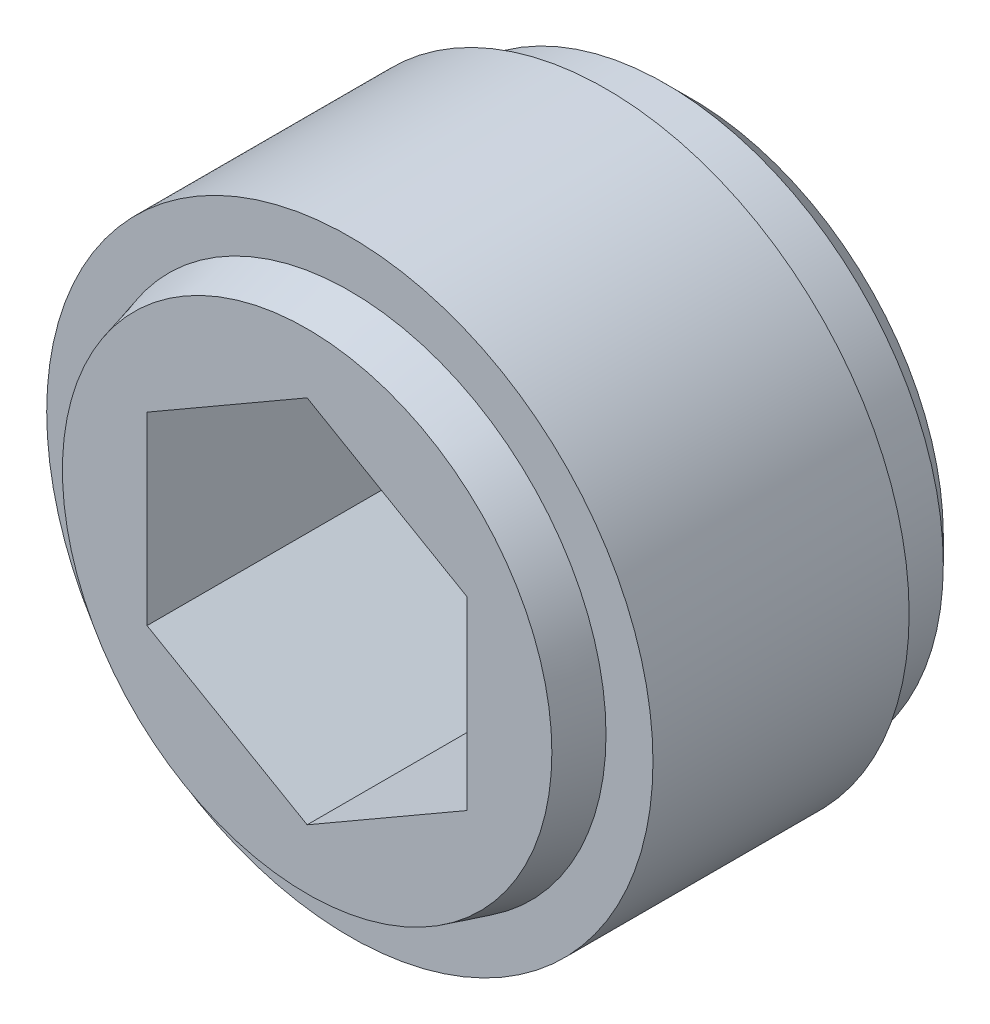
ISO-10303-21;
HEADER;
FILE_DESCRIPTION(('STEP AP214'),'2;1');
FILE_NAME('part.step','',(''),(''),'','','');
FILE_SCHEMA(('AUTOMOTIVE_DESIGN { 1 0 10303 214 1 1 1 1 }'));
ENDSEC;
DATA;
#1=APPLICATION_CONTEXT('core data for automotive mechanical design processes');
#2=APPLICATION_PROTOCOL_DEFINITION('international standard','automotive_design',2000,#1);
#3=PRODUCT_CONTEXT('',#1,'mechanical');
#4=PRODUCT('Part','Part','',(#3));
#5=PRODUCT_RELATED_PRODUCT_CATEGORY('part','',(#4));
#6=PRODUCT_DEFINITION_FORMATION('','',#4);
#7=PRODUCT_DEFINITION_CONTEXT('part definition',#1,'design');
#8=PRODUCT_DEFINITION('design','',#6,#7);
#9=PRODUCT_DEFINITION_SHAPE('','',#8);
#10=(LENGTH_UNIT() NAMED_UNIT(*) SI_UNIT(.MILLI.,.METRE.));
#11=(NAMED_UNIT(*) PLANE_ANGLE_UNIT() SI_UNIT($,.RADIAN.));
#12=(NAMED_UNIT(*) SI_UNIT($,.STERADIAN.) SOLID_ANGLE_UNIT());
#13=UNCERTAINTY_MEASURE_WITH_UNIT(LENGTH_MEASURE(1.E-05),#10,'distance_accuracy_value','');
#14=(GEOMETRIC_REPRESENTATION_CONTEXT(3) GLOBAL_UNCERTAINTY_ASSIGNED_CONTEXT((#13)) GLOBAL_UNIT_ASSIGNED_CONTEXT((#10,
#11,#12)) REPRESENTATION_CONTEXT('',''));
#15=CARTESIAN_POINT('',(0.,0.,0.));
#16=DIRECTION('',(0.,0.,1.));
#17=DIRECTION('',(1.,0.,0.));
#18=AXIS2_PLACEMENT_3D('',#15,#16,#17);
#19=CARTESIAN_POINT('',(0.,0.,5.08));
#20=DIRECTION('',(0.,0.,-1.));
#21=DIRECTION('',(-1.,0.,0.));
#22=AXIS2_PLACEMENT_3D('',#19,#20,#21);
#23=CYLINDRICAL_SURFACE('',#22,4.5085);
#24=CARTESIAN_POINT('',(0.,0.,5.08));
#25=DIRECTION('',(0.,0.,1.));
#26=DIRECTION('',(1.,0.,0.));
#27=AXIS2_PLACEMENT_3D('',#24,#25,#26);
#28=CIRCLE('',#27,4.5085);
#29=CARTESIAN_POINT('',(4.5085,0.,5.08));
#30=VERTEX_POINT('',#29);
#31=EDGE_CURVE('E149',#30,#30,#28,.T.);
#32=ORIENTED_EDGE('',*,*,#31,.F.);
#33=EDGE_LOOP('',(#32));
#34=FACE_BOUND('',#33,.T.);
#35=CARTESIAN_POINT('',(0.,0.,1.27));
#36=DIRECTION('',(0.,0.,-1.));
#37=DIRECTION('',(-1.,0.,0.));
#38=AXIS2_PLACEMENT_3D('',#35,#36,#37);
#39=CIRCLE('',#38,4.5085);
#40=CARTESIAN_POINT('',(-4.5085,0.,1.27));
#41=VERTEX_POINT('',#40);
#42=EDGE_CURVE('E142',#41,#41,#39,.T.);
#43=ORIENTED_EDGE('',*,*,#42,.F.);
#44=EDGE_LOOP('',(#43));
#45=FACE_BOUND('',#44,.T.);
#46=ADVANCED_FACE('F34',(#34,#45),#23,.T.);
#47=CARTESIAN_POINT('',(0.,0.,5.08));
#48=DIRECTION('',(0.,0.,1.));
#49=DIRECTION('',(1.,0.,0.));
#50=AXIS2_PLACEMENT_3D('',#47,#48,#49);
#51=PLANE('',#50);
#52=CARTESIAN_POINT('',(0.,0.,5.08));
#53=DIRECTION('',(0.,0.,1.));
#54=DIRECTION('',(1.,0.,0.));
#55=AXIS2_PLACEMENT_3D('',#52,#53,#54);
#56=CIRCLE('',#55,3.81);
#57=CARTESIAN_POINT('',(3.81,0.,5.08));
#58=VERTEX_POINT('',#57);
#59=EDGE_CURVE('E146',#58,#58,#56,.T.);
#60=ORIENTED_EDGE('',*,*,#59,.F.);
#61=EDGE_LOOP('',(#60));
#62=FACE_BOUND('',#61,.T.);
#63=ORIENTED_EDGE('',*,*,#31,.T.);
#64=EDGE_LOOP('',(#63));
#65=FACE_BOUND('',#64,.T.);
#66=ADVANCED_FACE('F171',(#62,#65),#51,.T.);
#67=CARTESIAN_POINT('',(0.,0.,5.08));
#68=DIRECTION('',(0.,0.,-1.));
#69=DIRECTION('',(1.,0.,0.));
#70=AXIS2_PLACEMENT_3D('',#67,#68,#69);
#71=CONICAL_SURFACE('',#70,3.81,0.26179938779915);
#72=CARTESIAN_POINT('',(0.,0.,5.715));
#73=DIRECTION('',(0.,0.,1.));
#74=DIRECTION('',(1.,0.,0.));
#75=AXIS2_PLACEMENT_3D('',#72,#73,#74);
#76=CIRCLE('',#75,3.63985226280624);
#77=CARTESIAN_POINT('',(3.63985226280624,0.,5.715));
#78=VERTEX_POINT('',#77);
#79=EDGE_CURVE('E145',#78,#78,#76,.T.);
#80=ORIENTED_EDGE('',*,*,#79,.F.);
#81=EDGE_LOOP('',(#80));
#82=FACE_BOUND('',#81,.T.);
#83=ORIENTED_EDGE('',*,*,#59,.T.);
#84=EDGE_LOOP('',(#83));
#85=FACE_BOUND('',#84,.T.);
#86=ADVANCED_FACE('F176',(#82,#85),#71,.T.);
#87=CARTESIAN_POINT('',(0.,0.,5.715));
#88=DIRECTION('',(0.,0.,1.));
#89=DIRECTION('',(1.,0.,0.));
#90=AXIS2_PLACEMENT_3D('',#87,#88,#89);
#91=PLANE('',#90);
#92=DIRECTION('',(0.866025403784439,0.5,0.));
#93=VECTOR('',#92,1.);
#94=CARTESIAN_POINT('',(-2.38125,1.3748153285078,5.715));
#95=LINE('',#94,#93);
#96=CARTESIAN_POINT('',(-2.38125,1.3748153285078,5.715));
#97=VERTEX_POINT('',#96);
#98=CARTESIAN_POINT('',(0.,2.74963065701559,5.715));
#99=VERTEX_POINT('',#98);
#100=EDGE_CURVE('E89',#97,#99,#95,.T.);
#101=ORIENTED_EDGE('',*,*,#100,.T.);
#102=DIRECTION('',(0.866025403784439,-0.5,0.));
#103=VECTOR('',#102,1.);
#104=CARTESIAN_POINT('',(0.,2.74963065701559,5.715));
#105=LINE('',#104,#103);
#106=CARTESIAN_POINT('',(2.38125,1.3748153285078,5.715));
#107=VERTEX_POINT('',#106);
#108=EDGE_CURVE('E98',#99,#107,#105,.T.);
#109=ORIENTED_EDGE('',*,*,#108,.T.);
#110=DIRECTION('',(0.,-1.,0.));
#111=VECTOR('',#110,1.);
#112=CARTESIAN_POINT('',(2.38125,1.3748153285078,5.715));
#113=LINE('',#112,#111);
#114=CARTESIAN_POINT('',(2.38125,-1.3748153285078,5.715));
#115=VERTEX_POINT('',#114);
#116=EDGE_CURVE('E49',#107,#115,#113,.T.);
#117=ORIENTED_EDGE('',*,*,#116,.T.);
#118=DIRECTION('',(-0.866025403784439,-0.5,0.));
#119=VECTOR('',#118,1.);
#120=CARTESIAN_POINT('',(2.38125,-1.3748153285078,5.715));
#121=LINE('',#120,#119);
#122=CARTESIAN_POINT('',(0.,-2.74963065701559,5.715));
#123=VERTEX_POINT('',#122);
#124=EDGE_CURVE('E113',#115,#123,#121,.T.);
#125=ORIENTED_EDGE('',*,*,#124,.T.);
#126=DIRECTION('',(-0.866025403784439,0.5,0.));
#127=VECTOR('',#126,1.);
#128=CARTESIAN_POINT('',(0.,-2.74963065701559,5.715));
#129=LINE('',#128,#127);
#130=CARTESIAN_POINT('',(-2.38125,-1.3748153285078,5.715));
#131=VERTEX_POINT('',#130);
#132=EDGE_CURVE('E116',#123,#131,#129,.T.);
#133=ORIENTED_EDGE('',*,*,#132,.T.);
#134=DIRECTION('',(0.,1.,0.));
#135=VECTOR('',#134,1.);
#136=CARTESIAN_POINT('',(-2.38125,-1.3748153285078,5.715));
#137=LINE('',#136,#135);
#138=EDGE_CURVE('E95',#131,#97,#137,.T.);
#139=ORIENTED_EDGE('',*,*,#138,.T.);
#140=EDGE_LOOP('',(#101,#109,#117,#125,#133,#139));
#141=FACE_BOUND('',#140,.T.);
#142=ORIENTED_EDGE('',*,*,#79,.T.);
#143=EDGE_LOOP('',(#142));
#144=FACE_BOUND('',#143,.T.);
#145=ADVANCED_FACE('F102',(#141,#144),#91,.T.);
#146=CARTESIAN_POINT('',(0.,0.,1.27));
#147=DIRECTION('',(0.,0.,-1.));
#148=DIRECTION('',(-1.,0.,0.));
#149=AXIS2_PLACEMENT_3D('',#146,#147,#148);
#150=PLANE('',#149);
#151=CARTESIAN_POINT('',(0.,0.,1.27));
#152=DIRECTION('',(0.,0.,-1.));
#153=DIRECTION('',(-1.,0.,0.));
#154=AXIS2_PLACEMENT_3D('',#151,#152,#153);
#155=CIRCLE('',#154,4.1275);
#156=CARTESIAN_POINT('',(-4.1275,0.,1.27));
#157=VERTEX_POINT('',#156);
#158=EDGE_CURVE('E132',#157,#157,#155,.T.);
#159=ORIENTED_EDGE('',*,*,#158,.F.);
#160=EDGE_LOOP('',(#159));
#161=FACE_BOUND('',#160,.T.);
#162=ORIENTED_EDGE('',*,*,#42,.T.);
#163=EDGE_LOOP('',(#162));
#164=FACE_BOUND('',#163,.T.);
#165=ADVANCED_FACE('F187',(#161,#164),#150,.T.);
#166=CARTESIAN_POINT('',(0.,0.,1.27));
#167=DIRECTION('',(0.,0.,-1.));
#168=DIRECTION('',(-1.,0.,0.));
#169=AXIS2_PLACEMENT_3D('',#166,#167,#168);
#170=CYLINDRICAL_SURFACE('',#169,4.1275);
#171=CARTESIAN_POINT('',(0.,0.,0.381000000000001));
#172=DIRECTION('',(0.,0.,1.));
#173=DIRECTION('',(1.,0.,0.));
#174=AXIS2_PLACEMENT_3D('',#171,#172,#173);
#175=CIRCLE('',#174,4.1275);
#176=CARTESIAN_POINT('',(4.1275,0.,0.381000000000001));
#177=VERTEX_POINT('',#176);
#178=EDGE_CURVE('E11',#177,#177,#175,.T.);
#179=ORIENTED_EDGE('',*,*,#178,.T.);
#180=EDGE_LOOP('',(#179));
#181=FACE_BOUND('',#180,.T.);
#182=ORIENTED_EDGE('',*,*,#158,.T.);
#183=EDGE_LOOP('',(#182));
#184=FACE_BOUND('',#183,.T.);
#185=ADVANCED_FACE('F166',(#181,#184),#170,.T.);
#186=CARTESIAN_POINT('',(0.,0.,0.));
#187=DIRECTION('',(0.,0.,1.));
#188=DIRECTION('',(1.,0.,0.));
#189=AXIS2_PLACEMENT_3D('',#186,#187,#188);
#190=PLANE('',#189);
#191=DIRECTION('',(0.866025403784439,-0.5,0.));
#192=VECTOR('',#191,1.);
#193=CARTESIAN_POINT('',(0.,2.74963065701559,0.));
#194=LINE('',#193,#192);
#195=CARTESIAN_POINT('',(0.,2.74963065701559,0.));
#196=VERTEX_POINT('',#195);
#197=CARTESIAN_POINT('',(2.38125,1.3748153285078,0.));
#198=VERTEX_POINT('',#197);
#199=EDGE_CURVE('E120',#196,#198,#194,.T.);
#200=ORIENTED_EDGE('',*,*,#199,.F.);
#201=DIRECTION('',(0.866025403784439,0.5,0.));
#202=VECTOR('',#201,1.);
#203=CARTESIAN_POINT('',(-2.38125,1.3748153285078,0.));
#204=LINE('',#203,#202);
#205=CARTESIAN_POINT('',(-2.38125,1.3748153285078,0.));
#206=VERTEX_POINT('',#205);
#207=EDGE_CURVE('E57',#206,#196,#204,.T.);
#208=ORIENTED_EDGE('',*,*,#207,.F.);
#209=DIRECTION('',(0.,1.,0.));
#210=VECTOR('',#209,1.);
#211=CARTESIAN_POINT('',(-2.38125,-1.3748153285078,0.));
#212=LINE('',#211,#210);
#213=CARTESIAN_POINT('',(-2.38125,-1.3748153285078,0.));
#214=VERTEX_POINT('',#213);
#215=EDGE_CURVE('E106',#214,#206,#212,.T.);
#216=ORIENTED_EDGE('',*,*,#215,.F.);
#217=DIRECTION('',(-0.866025403784439,0.5,0.));
#218=VECTOR('',#217,1.);
#219=CARTESIAN_POINT('',(0.,-2.74963065701559,0.));
#220=LINE('',#219,#218);
#221=CARTESIAN_POINT('',(0.,-2.74963065701559,0.));
#222=VERTEX_POINT('',#221);
#223=EDGE_CURVE('E109',#222,#214,#220,.T.);
#224=ORIENTED_EDGE('',*,*,#223,.F.);
#225=DIRECTION('',(-0.866025403784439,-0.5,0.));
#226=VECTOR('',#225,1.);
#227=CARTESIAN_POINT('',(2.38125,-1.3748153285078,0.));
#228=LINE('',#227,#226);
#229=CARTESIAN_POINT('',(2.38125,-1.3748153285078,0.));
#230=VERTEX_POINT('',#229);
#231=EDGE_CURVE('E125',#230,#222,#228,.T.);
#232=ORIENTED_EDGE('',*,*,#231,.F.);
#233=DIRECTION('',(0.,-1.,0.));
#234=VECTOR('',#233,1.);
#235=CARTESIAN_POINT('',(2.38125,1.3748153285078,0.));
#236=LINE('',#235,#234);
#237=EDGE_CURVE('E122',#198,#230,#236,.T.);
#238=ORIENTED_EDGE('',*,*,#237,.F.);
#239=EDGE_LOOP('',(#200,#208,#216,#224,#232,#238));
#240=FACE_BOUND('',#239,.T.);
#241=CARTESIAN_POINT('',(0.,0.,0.));
#242=DIRECTION('',(0.,0.,1.));
#243=DIRECTION('',(1.,0.,0.));
#244=AXIS2_PLACEMENT_3D('',#241,#242,#243);
#245=CIRCLE('',#244,3.7465);
#246=CARTESIAN_POINT('',(3.7465,0.,0.));
#247=VERTEX_POINT('',#246);
#248=EDGE_CURVE('E42',#247,#247,#245,.F.);
#249=ORIENTED_EDGE('',*,*,#248,.T.);
#250=EDGE_LOOP('',(#249));
#251=FACE_BOUND('',#250,.T.);
#252=ADVANCED_FACE('F156',(#240,#251),#190,.F.);
#253=CARTESIAN_POINT('',(0.,0.,0.));
#254=DIRECTION('',(0.,0.,1.));
#255=DIRECTION('',(1.,0.,0.));
#256=AXIS2_PLACEMENT_3D('',#253,#254,#255);
#257=CONICAL_SURFACE('',#256,3.7465,0.785398163397447);
#258=ORIENTED_EDGE('',*,*,#178,.F.);
#259=EDGE_LOOP('',(#258));
#260=FACE_BOUND('',#259,.T.);
#261=ORIENTED_EDGE('',*,*,#248,.F.);
#262=EDGE_LOOP('',(#261));
#263=FACE_BOUND('',#262,.T.);
#264=ADVANCED_FACE('F36',(#260,#263),#257,.T.);
#265=CARTESIAN_POINT('',(-2.38125,1.3748153285078,5.715));
#266=DIRECTION('',(-0.5,0.866025403784439,0.));
#267=DIRECTION('',(-0.866025403784439,-0.5,0.));
#268=AXIS2_PLACEMENT_3D('',#265,#266,#267);
#269=PLANE('',#268);
#270=ORIENTED_EDGE('',*,*,#207,.T.);
#271=DIRECTION('',(0.,0.,-1.));
#272=VECTOR('',#271,1.);
#273=CARTESIAN_POINT('',(0.,2.74963065701559,5.715));
#274=LINE('',#273,#272);
#275=EDGE_CURVE('E85',#99,#196,#274,.T.);
#276=ORIENTED_EDGE('',*,*,#275,.F.);
#277=ORIENTED_EDGE('',*,*,#100,.F.);
#278=DIRECTION('',(0.,0.,-1.));
#279=VECTOR('',#278,1.);
#280=CARTESIAN_POINT('',(-2.38125,1.3748153285078,5.715));
#281=LINE('',#280,#279);
#282=EDGE_CURVE('E130',#97,#206,#281,.T.);
#283=ORIENTED_EDGE('',*,*,#282,.T.);
#284=EDGE_LOOP('',(#270,#276,#277,#283));
#285=FACE_BOUND('',#284,.T.);
#286=ADVANCED_FACE('F87',(#285),#269,.F.);
#287=CARTESIAN_POINT('',(-2.38125,-1.3748153285078,5.715));
#288=DIRECTION('',(-1.,0.,0.));
#289=DIRECTION('',(0.,0.,1.));
#290=AXIS2_PLACEMENT_3D('',#287,#288,#289);
#291=PLANE('',#290);
#292=ORIENTED_EDGE('',*,*,#215,.T.);
#293=ORIENTED_EDGE('',*,*,#282,.F.);
#294=ORIENTED_EDGE('',*,*,#138,.F.);
#295=DIRECTION('',(0.,0.,-1.));
#296=VECTOR('',#295,1.);
#297=CARTESIAN_POINT('',(-2.38125,-1.3748153285078,5.715));
#298=LINE('',#297,#296);
#299=EDGE_CURVE('E133',#131,#214,#298,.T.);
#300=ORIENTED_EDGE('',*,*,#299,.T.);
#301=EDGE_LOOP('',(#292,#293,#294,#300));
#302=FACE_BOUND('',#301,.T.);
#303=ADVANCED_FACE('F164',(#302),#291,.F.);
#304=CARTESIAN_POINT('',(0.,-2.74963065701559,5.715));
#305=DIRECTION('',(-0.5,-0.866025403784439,0.));
#306=DIRECTION('',(0.866025403784439,-0.5,0.));
#307=AXIS2_PLACEMENT_3D('',#304,#305,#306);
#308=PLANE('',#307);
#309=ORIENTED_EDGE('',*,*,#223,.T.);
#310=ORIENTED_EDGE('',*,*,#299,.F.);
#311=ORIENTED_EDGE('',*,*,#132,.F.);
#312=DIRECTION('',(0.,0.,-1.));
#313=VECTOR('',#312,1.);
#314=CARTESIAN_POINT('',(0.,-2.74963065701559,5.715));
#315=LINE('',#314,#313);
#316=EDGE_CURVE('E135',#123,#222,#315,.T.);
#317=ORIENTED_EDGE('',*,*,#316,.T.);
#318=EDGE_LOOP('',(#309,#310,#311,#317));
#319=FACE_BOUND('',#318,.T.);
#320=ADVANCED_FACE('F202',(#319),#308,.F.);
#321=CARTESIAN_POINT('',(2.38125,-1.3748153285078,5.715));
#322=DIRECTION('',(0.5,-0.866025403784439,0.));
#323=DIRECTION('',(0.866025403784439,0.5,0.));
#324=AXIS2_PLACEMENT_3D('',#321,#322,#323);
#325=PLANE('',#324);
#326=ORIENTED_EDGE('',*,*,#231,.T.);
#327=ORIENTED_EDGE('',*,*,#316,.F.);
#328=ORIENTED_EDGE('',*,*,#124,.F.);
#329=DIRECTION('',(0.,0.,-1.));
#330=VECTOR('',#329,1.);
#331=CARTESIAN_POINT('',(2.38125,-1.3748153285078,5.715));
#332=LINE('',#331,#330);
#333=EDGE_CURVE('E137',#115,#230,#332,.T.);
#334=ORIENTED_EDGE('',*,*,#333,.T.);
#335=EDGE_LOOP('',(#326,#327,#328,#334));
#336=FACE_BOUND('',#335,.T.);
#337=ADVANCED_FACE('F199',(#336),#325,.F.);
#338=CARTESIAN_POINT('',(2.38125,1.3748153285078,5.715));
#339=DIRECTION('',(1.,0.,0.));
#340=DIRECTION('',(0.,0.,-1.));
#341=AXIS2_PLACEMENT_3D('',#338,#339,#340);
#342=PLANE('',#341);
#343=ORIENTED_EDGE('',*,*,#237,.T.);
#344=ORIENTED_EDGE('',*,*,#333,.F.);
#345=ORIENTED_EDGE('',*,*,#116,.F.);
#346=DIRECTION('',(0.,0.,-1.));
#347=VECTOR('',#346,1.);
#348=CARTESIAN_POINT('',(2.38125,1.3748153285078,5.715));
#349=LINE('',#348,#347);
#350=EDGE_CURVE('E94',#107,#198,#349,.T.);
#351=ORIENTED_EDGE('',*,*,#350,.T.);
#352=EDGE_LOOP('',(#343,#344,#345,#351));
#353=FACE_BOUND('',#352,.T.);
#354=ADVANCED_FACE('F196',(#353),#342,.F.);
#355=CARTESIAN_POINT('',(0.,2.74963065701559,5.715));
#356=DIRECTION('',(0.5,0.866025403784439,0.));
#357=DIRECTION('',(-0.866025403784439,0.5,0.));
#358=AXIS2_PLACEMENT_3D('',#355,#356,#357);
#359=PLANE('',#358);
#360=ORIENTED_EDGE('',*,*,#199,.T.);
#361=ORIENTED_EDGE('',*,*,#350,.F.);
#362=ORIENTED_EDGE('',*,*,#108,.F.);
#363=ORIENTED_EDGE('',*,*,#275,.T.);
#364=EDGE_LOOP('',(#360,#361,#362,#363));
#365=FACE_BOUND('',#364,.T.);
#366=ADVANCED_FACE('F99',(#365),#359,.F.);
#367=CLOSED_SHELL('',(#46,#66,#86,#145,#165,#185,#252,#264,#286,#303,#320,#337,#354,#366));
#368=MANIFOLD_SOLID_BREP('B2',#367);
#369=ADVANCED_BREP_SHAPE_REPRESENTATION('',(#18,#368),#14);
#370=SHAPE_DEFINITION_REPRESENTATION(#9,#369);
ENDSEC;
END-ISO-10303-21;
